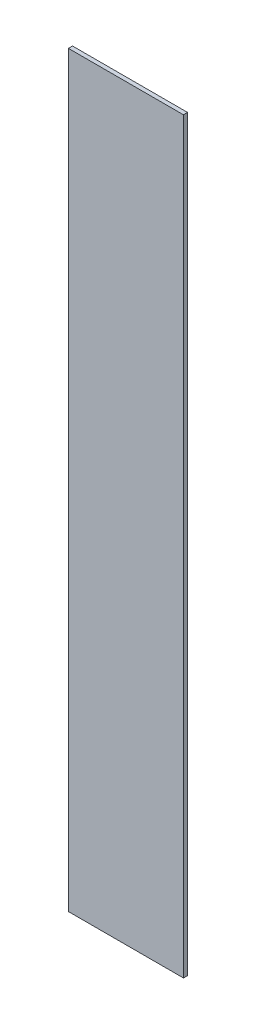
ISO-10303-21;
HEADER;
FILE_DESCRIPTION(('STEP AP214'),'2;1');
FILE_NAME('part.step','',(''),(''),'','','');
FILE_SCHEMA(('AUTOMOTIVE_DESIGN { 1 0 10303 214 1 1 1 1 }'));
ENDSEC;
DATA;
#1=APPLICATION_CONTEXT('core data for automotive mechanical design processes');
#2=APPLICATION_PROTOCOL_DEFINITION('international standard','automotive_design',2000,#1);
#3=PRODUCT_CONTEXT('',#1,'mechanical');
#4=PRODUCT('Part','Part','',(#3));
#5=PRODUCT_RELATED_PRODUCT_CATEGORY('part','',(#4));
#6=PRODUCT_DEFINITION_FORMATION('','',#4);
#7=PRODUCT_DEFINITION_CONTEXT('part definition',#1,'design');
#8=PRODUCT_DEFINITION('design','',#6,#7);
#9=PRODUCT_DEFINITION_SHAPE('','',#8);
#10=(LENGTH_UNIT() NAMED_UNIT(*) SI_UNIT(.MILLI.,.METRE.));
#11=(NAMED_UNIT(*) PLANE_ANGLE_UNIT() SI_UNIT($,.RADIAN.));
#12=(NAMED_UNIT(*) SI_UNIT($,.STERADIAN.) SOLID_ANGLE_UNIT());
#13=UNCERTAINTY_MEASURE_WITH_UNIT(LENGTH_MEASURE(1.E-05),#10,'distance_accuracy_value','');
#14=(GEOMETRIC_REPRESENTATION_CONTEXT(3) GLOBAL_UNCERTAINTY_ASSIGNED_CONTEXT((#13)) GLOBAL_UNIT_ASSIGNED_CONTEXT((#10,
#11,#12)) REPRESENTATION_CONTEXT('',''));
#15=CARTESIAN_POINT('',(0.,0.,0.));
#16=DIRECTION('',(0.,0.,1.));
#17=DIRECTION('',(1.,0.,0.));
#18=AXIS2_PLACEMENT_3D('',#15,#16,#17);
#19=CARTESIAN_POINT('',(133.,879.,27.));
#20=DIRECTION('',(1.,0.,0.));
#21=DIRECTION('',(0.,0.,-1.));
#22=AXIS2_PLACEMENT_3D('',#19,#20,#21);
#23=PLANE('',#22);
#24=DIRECTION('',(0.,-1.,0.));
#25=VECTOR('',#24,1.);
#26=CARTESIAN_POINT('',(133.,879.,26.));
#27=LINE('',#26,#25);
#28=CARTESIAN_POINT('',(133.,1061.,26.));
#29=VERTEX_POINT('',#28);
#30=CARTESIAN_POINT('',(133.,879.,26.));
#31=VERTEX_POINT('',#30);
#32=EDGE_CURVE('E102',#29,#31,#27,.T.);
#33=ORIENTED_EDGE('',*,*,#32,.T.);
#34=DIRECTION('',(0.,0.,-1.));
#35=VECTOR('',#34,1.);
#36=CARTESIAN_POINT('',(133.,879.,27.));
#37=LINE('',#36,#35);
#38=CARTESIAN_POINT('',(133.,879.,27.));
#39=VERTEX_POINT('',#38);
#40=EDGE_CURVE('E11',#39,#31,#37,.T.);
#41=ORIENTED_EDGE('',*,*,#40,.F.);
#42=DIRECTION('',(0.,-1.,0.));
#43=VECTOR('',#42,1.);
#44=CARTESIAN_POINT('',(133.,879.,27.));
#45=LINE('',#44,#43);
#46=CARTESIAN_POINT('',(133.,1061.,27.));
#47=VERTEX_POINT('',#46);
#48=EDGE_CURVE('E90',#47,#39,#45,.T.);
#49=ORIENTED_EDGE('',*,*,#48,.F.);
#50=DIRECTION('',(0.,0.,-1.));
#51=VECTOR('',#50,1.);
#52=CARTESIAN_POINT('',(133.,1061.,27.));
#53=LINE('',#52,#51);
#54=EDGE_CURVE('E98',#47,#29,#53,.T.);
#55=ORIENTED_EDGE('',*,*,#54,.T.);
#56=EDGE_LOOP('',(#33,#41,#49,#55));
#57=FACE_BOUND('',#56,.T.);
#58=ADVANCED_FACE('F39',(#57),#23,.F.);
#59=CARTESIAN_POINT('',(133.,879.,27.));
#60=DIRECTION('',(0.,1.,0.));
#61=DIRECTION('',(0.,0.,1.));
#62=AXIS2_PLACEMENT_3D('',#59,#60,#61);
#63=PLANE('',#62);
#64=DIRECTION('',(1.,0.,0.));
#65=VECTOR('',#64,1.);
#66=CARTESIAN_POINT('',(133.,879.,26.));
#67=LINE('',#66,#65);
#68=CARTESIAN_POINT('',(161.,879.,26.));
#69=VERTEX_POINT('',#68);
#70=EDGE_CURVE('E94',#31,#69,#67,.T.);
#71=ORIENTED_EDGE('',*,*,#70,.T.);
#72=DIRECTION('',(0.,0.,-1.));
#73=VECTOR('',#72,1.);
#74=CARTESIAN_POINT('',(161.,879.,27.));
#75=LINE('',#74,#73);
#76=CARTESIAN_POINT('',(161.,879.,27.));
#77=VERTEX_POINT('',#76);
#78=EDGE_CURVE('E47',#77,#69,#75,.T.);
#79=ORIENTED_EDGE('',*,*,#78,.F.);
#80=DIRECTION('',(1.,0.,0.));
#81=VECTOR('',#80,1.);
#82=CARTESIAN_POINT('',(133.,879.,27.));
#83=LINE('',#82,#81);
#84=EDGE_CURVE('E85',#39,#77,#83,.T.);
#85=ORIENTED_EDGE('',*,*,#84,.F.);
#86=ORIENTED_EDGE('',*,*,#40,.T.);
#87=EDGE_LOOP('',(#71,#79,#85,#86));
#88=FACE_BOUND('',#87,.T.);
#89=ADVANCED_FACE('F93',(#88),#63,.F.);
#90=CARTESIAN_POINT('',(161.,879.,27.));
#91=DIRECTION('',(-1.,0.,0.));
#92=DIRECTION('',(0.,0.,1.));
#93=AXIS2_PLACEMENT_3D('',#90,#91,#92);
#94=PLANE('',#93);
#95=DIRECTION('',(0.,1.,0.));
#96=VECTOR('',#95,1.);
#97=CARTESIAN_POINT('',(161.,879.,26.));
#98=LINE('',#97,#96);
#99=CARTESIAN_POINT('',(161.,1061.,26.));
#100=VERTEX_POINT('',#99);
#101=EDGE_CURVE('E72',#69,#100,#98,.T.);
#102=ORIENTED_EDGE('',*,*,#101,.T.);
#103=DIRECTION('',(0.,0.,-1.));
#104=VECTOR('',#103,1.);
#105=CARTESIAN_POINT('',(161.,1061.,27.));
#106=LINE('',#105,#104);
#107=CARTESIAN_POINT('',(161.,1061.,27.));
#108=VERTEX_POINT('',#107);
#109=EDGE_CURVE('E95',#108,#100,#106,.T.);
#110=ORIENTED_EDGE('',*,*,#109,.F.);
#111=DIRECTION('',(0.,1.,0.));
#112=VECTOR('',#111,1.);
#113=CARTESIAN_POINT('',(161.,879.,27.));
#114=LINE('',#113,#112);
#115=EDGE_CURVE('E88',#77,#108,#114,.T.);
#116=ORIENTED_EDGE('',*,*,#115,.F.);
#117=ORIENTED_EDGE('',*,*,#78,.T.);
#118=EDGE_LOOP('',(#102,#110,#116,#117));
#119=FACE_BOUND('',#118,.T.);
#120=ADVANCED_FACE('F96',(#119),#94,.F.);
#121=CARTESIAN_POINT('',(133.,1061.,27.));
#122=DIRECTION('',(0.,-1.,0.));
#123=DIRECTION('',(0.,0.,-1.));
#124=AXIS2_PLACEMENT_3D('',#121,#122,#123);
#125=PLANE('',#124);
#126=DIRECTION('',(-1.,0.,0.));
#127=VECTOR('',#126,1.);
#128=CARTESIAN_POINT('',(133.,1061.,26.));
#129=LINE('',#128,#127);
#130=EDGE_CURVE('E78',#100,#29,#129,.T.);
#131=ORIENTED_EDGE('',*,*,#130,.T.);
#132=ORIENTED_EDGE('',*,*,#54,.F.);
#133=DIRECTION('',(-1.,0.,0.));
#134=VECTOR('',#133,1.);
#135=CARTESIAN_POINT('',(133.,1061.,27.));
#136=LINE('',#135,#134);
#137=EDGE_CURVE('E55',#108,#47,#136,.T.);
#138=ORIENTED_EDGE('',*,*,#137,.F.);
#139=ORIENTED_EDGE('',*,*,#109,.T.);
#140=EDGE_LOOP('',(#131,#132,#138,#139));
#141=FACE_BOUND('',#140,.T.);
#142=ADVANCED_FACE('F109',(#141),#125,.F.);
#143=CARTESIAN_POINT('',(0.,0.,27.));
#144=DIRECTION('',(0.,0.,-1.));
#145=DIRECTION('',(-1.,0.,0.));
#146=AXIS2_PLACEMENT_3D('',#143,#144,#145);
#147=PLANE('',#146);
#148=ORIENTED_EDGE('',*,*,#48,.T.);
#149=ORIENTED_EDGE('',*,*,#84,.T.);
#150=ORIENTED_EDGE('',*,*,#115,.T.);
#151=ORIENTED_EDGE('',*,*,#137,.T.);
#152=EDGE_LOOP('',(#148,#149,#150,#151));
#153=FACE_BOUND('',#152,.T.);
#154=ADVANCED_FACE('F86',(#153),#147,.F.);
#155=CARTESIAN_POINT('',(0.,0.,26.));
#156=DIRECTION('',(0.,0.,-1.));
#157=DIRECTION('',(-1.,0.,0.));
#158=AXIS2_PLACEMENT_3D('',#155,#156,#157);
#159=PLANE('',#158);
#160=ORIENTED_EDGE('',*,*,#32,.F.);
#161=ORIENTED_EDGE('',*,*,#130,.F.);
#162=ORIENTED_EDGE('',*,*,#101,.F.);
#163=ORIENTED_EDGE('',*,*,#70,.F.);
#164=EDGE_LOOP('',(#160,#161,#162,#163));
#165=FACE_BOUND('',#164,.T.);
#166=ADVANCED_FACE('F112',(#165),#159,.T.);
#167=CLOSED_SHELL('',(#58,#89,#120,#142,#154,#166));
#168=MANIFOLD_SOLID_BREP('B2',#167);
#169=ADVANCED_BREP_SHAPE_REPRESENTATION('',(#18,#168),#14);
#170=SHAPE_DEFINITION_REPRESENTATION(#9,#169);
ENDSEC;
END-ISO-10303-21;
